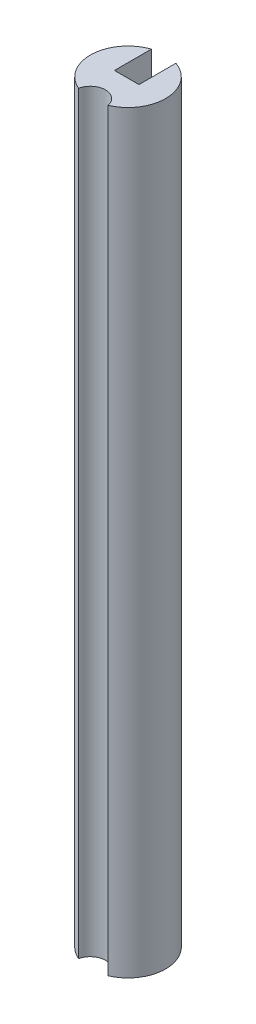
ISO-10303-21;
HEADER;
FILE_DESCRIPTION(('STEP AP214'),'2;1');
FILE_NAME('part.step','',(''),(''),'','','');
FILE_SCHEMA(('AUTOMOTIVE_DESIGN { 1 0 10303 214 1 1 1 1 }'));
ENDSEC;
DATA;
#1=APPLICATION_CONTEXT('core data for automotive mechanical design processes');
#2=APPLICATION_PROTOCOL_DEFINITION('international standard','automotive_design',2000,#1);
#3=PRODUCT_CONTEXT('',#1,'mechanical');
#4=PRODUCT('Part','Part','',(#3));
#5=PRODUCT_RELATED_PRODUCT_CATEGORY('part','',(#4));
#6=PRODUCT_DEFINITION_FORMATION('','',#4);
#7=PRODUCT_DEFINITION_CONTEXT('part definition',#1,'design');
#8=PRODUCT_DEFINITION('design','',#6,#7);
#9=PRODUCT_DEFINITION_SHAPE('','',#8);
#10=(LENGTH_UNIT() NAMED_UNIT(*) SI_UNIT(.MILLI.,.METRE.));
#11=(NAMED_UNIT(*) PLANE_ANGLE_UNIT() SI_UNIT($,.RADIAN.));
#12=(NAMED_UNIT(*) SI_UNIT($,.STERADIAN.) SOLID_ANGLE_UNIT());
#13=UNCERTAINTY_MEASURE_WITH_UNIT(LENGTH_MEASURE(1.E-05),#10,'distance_accuracy_value','');
#14=(GEOMETRIC_REPRESENTATION_CONTEXT(3) GLOBAL_UNCERTAINTY_ASSIGNED_CONTEXT((#13)) GLOBAL_UNIT_ASSIGNED_CONTEXT((#10,
#11,#12)) REPRESENTATION_CONTEXT('',''));
#15=CARTESIAN_POINT('',(0.,0.,0.));
#16=DIRECTION('',(0.,0.,1.));
#17=DIRECTION('',(1.,0.,0.));
#18=AXIS2_PLACEMENT_3D('',#15,#16,#17);
#19=CARTESIAN_POINT('',(-3.25,200.,0.342859840311132));
#20=DIRECTION('',(-1.,0.,0.));
#21=DIRECTION('',(0.,0.,1.));
#22=AXIS2_PLACEMENT_3D('',#19,#20,#21);
#23=PLANE('',#22);
#24=DIRECTION('',(0.,0.,-1.));
#25=VECTOR('',#24,1.);
#26=CARTESIAN_POINT('',(-3.25,0.,0.342859840311132));
#27=LINE('',#26,#25);
#28=CARTESIAN_POINT('',(-3.25,0.,0.342859840311132));
#29=VERTEX_POINT('',#28);
#30=CARTESIAN_POINT('',(-3.25,0.,-9.45714015968887));
#31=VERTEX_POINT('',#30);
#32=EDGE_CURVE('E114',#29,#31,#27,.T.);
#33=ORIENTED_EDGE('',*,*,#32,.T.);
#34=DIRECTION('',(0.,-1.,0.));
#35=VECTOR('',#34,1.);
#36=CARTESIAN_POINT('',(-3.25,200.,-9.45714015968887));
#37=LINE('',#36,#35);
#38=CARTESIAN_POINT('',(-3.25,200.,-9.45714015968887));
#39=VERTEX_POINT('',#38);
#40=EDGE_CURVE('E11',#39,#31,#37,.T.);
#41=ORIENTED_EDGE('',*,*,#40,.F.);
#42=DIRECTION('',(0.,0.,-1.));
#43=VECTOR('',#42,1.);
#44=CARTESIAN_POINT('',(-3.25,200.,0.342859840311132));
#45=LINE('',#44,#43);
#46=CARTESIAN_POINT('',(-3.25,200.,0.342859840311132));
#47=VERTEX_POINT('',#46);
#48=EDGE_CURVE('E124',#47,#39,#45,.T.);
#49=ORIENTED_EDGE('',*,*,#48,.F.);
#50=DIRECTION('',(0.,-1.,0.));
#51=VECTOR('',#50,1.);
#52=CARTESIAN_POINT('',(-3.25,200.,0.342859840311132));
#53=LINE('',#52,#51);
#54=EDGE_CURVE('E110',#47,#29,#53,.T.);
#55=ORIENTED_EDGE('',*,*,#54,.T.);
#56=EDGE_LOOP('',(#33,#41,#49,#55));
#57=FACE_BOUND('',#56,.T.);
#58=ADVANCED_FACE('F30',(#57),#23,.F.);
#59=CARTESIAN_POINT('',(0.,200.,0.));
#60=DIRECTION('',(0.,-1.,0.));
#61=DIRECTION('',(0.,0.,-1.));
#62=AXIS2_PLACEMENT_3D('',#59,#60,#61);
#63=CYLINDRICAL_SURFACE('',#62,10.);
#64=CARTESIAN_POINT('',(0.,0.,0.));
#65=DIRECTION('',(0.,1.,0.));
#66=DIRECTION('',(0.,0.,1.));
#67=AXIS2_PLACEMENT_3D('',#64,#65,#66);
#68=CIRCLE('',#67,10.);
#69=CARTESIAN_POINT('',(-3.91918358845308,0.,9.2));
#70=VERTEX_POINT('',#69);
#71=EDGE_CURVE('E117',#31,#70,#68,.T.);
#72=ORIENTED_EDGE('',*,*,#71,.T.);
#73=DIRECTION('',(0.,-1.,0.));
#74=VECTOR('',#73,1.);
#75=CARTESIAN_POINT('',(-3.91918358845308,200.,9.2));
#76=LINE('',#75,#74);
#77=CARTESIAN_POINT('',(-3.91918358845308,200.,9.2));
#78=VERTEX_POINT('',#77);
#79=EDGE_CURVE('E38',#78,#70,#76,.T.);
#80=ORIENTED_EDGE('',*,*,#79,.F.);
#81=CARTESIAN_POINT('',(0.,200.,0.));
#82=DIRECTION('',(0.,1.,0.));
#83=DIRECTION('',(0.,0.,1.));
#84=AXIS2_PLACEMENT_3D('',#81,#82,#83);
#85=CIRCLE('',#84,10.);
#86=EDGE_CURVE('E83',#39,#78,#85,.T.);
#87=ORIENTED_EDGE('',*,*,#86,.F.);
#88=ORIENTED_EDGE('',*,*,#40,.T.);
#89=EDGE_LOOP('',(#72,#80,#87,#88));
#90=FACE_BOUND('',#89,.T.);
#91=ADVANCED_FACE('F148',(#90),#63,.T.);
#92=CARTESIAN_POINT('',(0.,200.,10.));
#93=DIRECTION('',(0.,-1.,0.));
#94=DIRECTION('',(0.,0.,-1.));
#95=AXIS2_PLACEMENT_3D('',#92,#93,#94);
#96=CYLINDRICAL_SURFACE('',#95,4.);
#97=CARTESIAN_POINT('',(0.,0.,10.));
#98=DIRECTION('',(0.,-1.,0.));
#99=DIRECTION('',(0.,0.,1.));
#100=AXIS2_PLACEMENT_3D('',#97,#98,#99);
#101=CIRCLE('',#100,4.);
#102=CARTESIAN_POINT('',(3.91918358845309,0.,9.2));
#103=VERTEX_POINT('',#102);
#104=EDGE_CURVE('E119',#70,#103,#101,.T.);
#105=ORIENTED_EDGE('',*,*,#104,.T.);
#106=DIRECTION('',(0.,-1.,0.));
#107=VECTOR('',#106,1.);
#108=CARTESIAN_POINT('',(3.91918358845309,200.,9.2));
#109=LINE('',#108,#107);
#110=CARTESIAN_POINT('',(3.91918358845309,200.,9.2));
#111=VERTEX_POINT('',#110);
#112=EDGE_CURVE('E105',#111,#103,#109,.T.);
#113=ORIENTED_EDGE('',*,*,#112,.F.);
#114=CARTESIAN_POINT('',(0.,200.,10.));
#115=DIRECTION('',(0.,-1.,0.));
#116=DIRECTION('',(0.,0.,1.));
#117=AXIS2_PLACEMENT_3D('',#114,#115,#116);
#118=CIRCLE('',#117,4.);
#119=EDGE_CURVE('E96',#78,#111,#118,.T.);
#120=ORIENTED_EDGE('',*,*,#119,.F.);
#121=ORIENTED_EDGE('',*,*,#79,.T.);
#122=EDGE_LOOP('',(#105,#113,#120,#121));
#123=FACE_BOUND('',#122,.T.);
#124=ADVANCED_FACE('F130',(#123),#96,.F.);
#125=CARTESIAN_POINT('',(0.,200.,0.));
#126=DIRECTION('',(0.,-1.,0.));
#127=DIRECTION('',(0.,0.,-1.));
#128=AXIS2_PLACEMENT_3D('',#125,#126,#127);
#129=CYLINDRICAL_SURFACE('',#128,10.);
#130=CARTESIAN_POINT('',(0.,0.,0.));
#131=DIRECTION('',(0.,1.,0.));
#132=DIRECTION('',(0.,0.,1.));
#133=AXIS2_PLACEMENT_3D('',#130,#131,#132);
#134=CIRCLE('',#133,10.);
#135=CARTESIAN_POINT('',(3.25,0.,-9.45714015968887));
#136=VERTEX_POINT('',#135);
#137=EDGE_CURVE('E104',#103,#136,#134,.T.);
#138=ORIENTED_EDGE('',*,*,#137,.T.);
#139=DIRECTION('',(0.,-1.,0.));
#140=VECTOR('',#139,1.);
#141=CARTESIAN_POINT('',(3.25,200.,-9.45714015968887));
#142=LINE('',#141,#140);
#143=CARTESIAN_POINT('',(3.25,200.,-9.45714015968887));
#144=VERTEX_POINT('',#143);
#145=EDGE_CURVE('E101',#144,#136,#142,.T.);
#146=ORIENTED_EDGE('',*,*,#145,.F.);
#147=CARTESIAN_POINT('',(0.,200.,0.));
#148=DIRECTION('',(0.,1.,0.));
#149=DIRECTION('',(0.,0.,1.));
#150=AXIS2_PLACEMENT_3D('',#147,#148,#149);
#151=CIRCLE('',#150,10.);
#152=EDGE_CURVE('E90',#111,#144,#151,.T.);
#153=ORIENTED_EDGE('',*,*,#152,.F.);
#154=ORIENTED_EDGE('',*,*,#112,.T.);
#155=EDGE_LOOP('',(#138,#146,#153,#154));
#156=FACE_BOUND('',#155,.T.);
#157=ADVANCED_FACE('F102',(#156),#129,.T.);
#158=CARTESIAN_POINT('',(3.25,200.,0.342859840311132));
#159=DIRECTION('',(1.,0.,0.));
#160=DIRECTION('',(0.,0.,-1.));
#161=AXIS2_PLACEMENT_3D('',#158,#159,#160);
#162=PLANE('',#161);
#163=DIRECTION('',(0.,0.,1.));
#164=VECTOR('',#163,1.);
#165=CARTESIAN_POINT('',(3.25,0.,0.342859840311132));
#166=LINE('',#165,#164);
#167=CARTESIAN_POINT('',(3.25,0.,0.342859840311132));
#168=VERTEX_POINT('',#167);
#169=EDGE_CURVE('E69',#136,#168,#166,.T.);
#170=ORIENTED_EDGE('',*,*,#169,.T.);
#171=DIRECTION('',(0.,-1.,0.));
#172=VECTOR('',#171,1.);
#173=CARTESIAN_POINT('',(3.25,200.,0.342859840311132));
#174=LINE('',#173,#172);
#175=CARTESIAN_POINT('',(3.25,200.,0.342859840311132));
#176=VERTEX_POINT('',#175);
#177=EDGE_CURVE('E106',#176,#168,#174,.T.);
#178=ORIENTED_EDGE('',*,*,#177,.F.);
#179=DIRECTION('',(0.,0.,1.));
#180=VECTOR('',#179,1.);
#181=CARTESIAN_POINT('',(3.25,200.,0.342859840311132));
#182=LINE('',#181,#180);
#183=EDGE_CURVE('E94',#144,#176,#182,.T.);
#184=ORIENTED_EDGE('',*,*,#183,.F.);
#185=ORIENTED_EDGE('',*,*,#145,.T.);
#186=EDGE_LOOP('',(#170,#178,#184,#185));
#187=FACE_BOUND('',#186,.T.);
#188=ADVANCED_FACE('F108',(#187),#162,.F.);
#189=CARTESIAN_POINT('',(-3.25,200.,0.342859840311132));
#190=DIRECTION('',(0.,0.,1.));
#191=DIRECTION('',(1.,0.,0.));
#192=AXIS2_PLACEMENT_3D('',#189,#190,#191);
#193=PLANE('',#192);
#194=DIRECTION('',(-1.,0.,0.));
#195=VECTOR('',#194,1.);
#196=CARTESIAN_POINT('',(-3.25,0.,0.342859840311132));
#197=LINE('',#196,#195);
#198=EDGE_CURVE('E75',#168,#29,#197,.T.);
#199=ORIENTED_EDGE('',*,*,#198,.T.);
#200=ORIENTED_EDGE('',*,*,#54,.F.);
#201=DIRECTION('',(-1.,0.,0.));
#202=VECTOR('',#201,1.);
#203=CARTESIAN_POINT('',(-3.25,200.,0.342859840311132));
#204=LINE('',#203,#202);
#205=EDGE_CURVE('E46',#176,#47,#204,.T.);
#206=ORIENTED_EDGE('',*,*,#205,.F.);
#207=ORIENTED_EDGE('',*,*,#177,.T.);
#208=EDGE_LOOP('',(#199,#200,#206,#207));
#209=FACE_BOUND('',#208,.T.);
#210=ADVANCED_FACE('F137',(#209),#193,.F.);
#211=CARTESIAN_POINT('',(0.,200.,0.));
#212=DIRECTION('',(0.,1.,0.));
#213=DIRECTION('',(0.,0.,1.));
#214=AXIS2_PLACEMENT_3D('',#211,#212,#213);
#215=PLANE('',#214);
#216=ORIENTED_EDGE('',*,*,#48,.T.);
#217=ORIENTED_EDGE('',*,*,#86,.T.);
#218=ORIENTED_EDGE('',*,*,#119,.T.);
#219=ORIENTED_EDGE('',*,*,#152,.T.);
#220=ORIENTED_EDGE('',*,*,#183,.T.);
#221=ORIENTED_EDGE('',*,*,#205,.T.);
#222=EDGE_LOOP('',(#216,#217,#218,#219,#220,#221));
#223=FACE_BOUND('',#222,.T.);
#224=ADVANCED_FACE('F92',(#223),#215,.T.);
#225=CARTESIAN_POINT('',(0.,0.,0.));
#226=DIRECTION('',(0.,1.,0.));
#227=DIRECTION('',(0.,0.,1.));
#228=AXIS2_PLACEMENT_3D('',#225,#226,#227);
#229=PLANE('',#228);
#230=ORIENTED_EDGE('',*,*,#32,.F.);
#231=ORIENTED_EDGE('',*,*,#198,.F.);
#232=ORIENTED_EDGE('',*,*,#169,.F.);
#233=ORIENTED_EDGE('',*,*,#137,.F.);
#234=ORIENTED_EDGE('',*,*,#104,.F.);
#235=ORIENTED_EDGE('',*,*,#71,.F.);
#236=EDGE_LOOP('',(#230,#231,#232,#233,#234,#235));
#237=FACE_BOUND('',#236,.T.);
#238=ADVANCED_FACE('F133',(#237),#229,.F.);
#239=CLOSED_SHELL('',(#58,#91,#124,#157,#188,#210,#224,#238));
#240=MANIFOLD_SOLID_BREP('B2',#239);
#241=ADVANCED_BREP_SHAPE_REPRESENTATION('',(#18,#240),#14);
#242=SHAPE_DEFINITION_REPRESENTATION(#9,#241);
ENDSEC;
END-ISO-10303-21;
